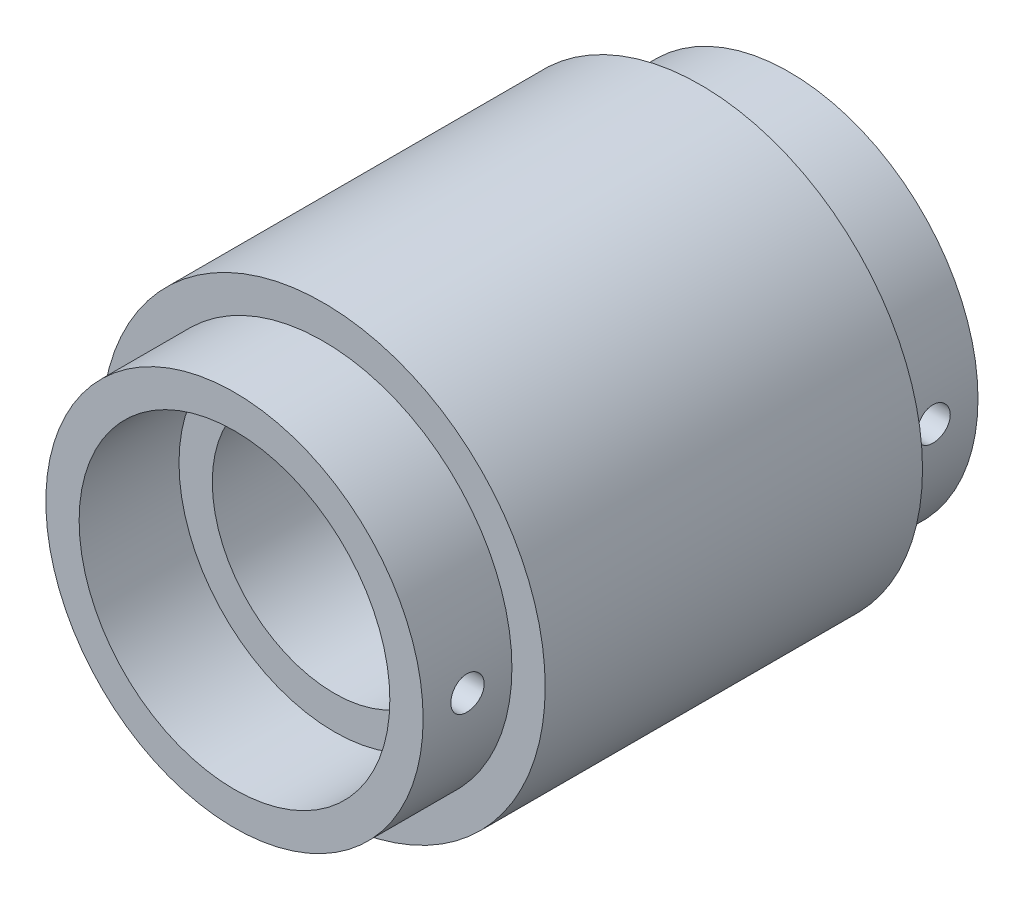
ISO-10303-21;
HEADER;
FILE_DESCRIPTION(('STEP AP214'),'2;1');
FILE_NAME('part.step','',(''),(''),'','','');
FILE_SCHEMA(('AUTOMOTIVE_DESIGN { 1 0 10303 214 1 1 1 1 }'));
ENDSEC;
DATA;
#1=APPLICATION_CONTEXT('core data for automotive mechanical design processes');
#2=APPLICATION_PROTOCOL_DEFINITION('international standard','automotive_design',2000,#1);
#3=PRODUCT_CONTEXT('',#1,'mechanical');
#4=PRODUCT('Part','Part','',(#3));
#5=PRODUCT_RELATED_PRODUCT_CATEGORY('part','',(#4));
#6=PRODUCT_DEFINITION_FORMATION('','',#4);
#7=PRODUCT_DEFINITION_CONTEXT('part definition',#1,'design');
#8=PRODUCT_DEFINITION('design','',#6,#7);
#9=PRODUCT_DEFINITION_SHAPE('','',#8);
#10=(LENGTH_UNIT() NAMED_UNIT(*) SI_UNIT(.MILLI.,.METRE.));
#11=(NAMED_UNIT(*) PLANE_ANGLE_UNIT() SI_UNIT($,.RADIAN.));
#12=(NAMED_UNIT(*) SI_UNIT($,.STERADIAN.) SOLID_ANGLE_UNIT());
#13=UNCERTAINTY_MEASURE_WITH_UNIT(LENGTH_MEASURE(1.E-05),#10,'distance_accuracy_value','');
#14=(GEOMETRIC_REPRESENTATION_CONTEXT(3) GLOBAL_UNCERTAINTY_ASSIGNED_CONTEXT((#13)) GLOBAL_UNIT_ASSIGNED_CONTEXT((#10,
#11,#12)) REPRESENTATION_CONTEXT('',''));
#15=CARTESIAN_POINT('',(0.,0.,0.));
#16=DIRECTION('',(0.,0.,1.));
#17=DIRECTION('',(1.,0.,0.));
#18=AXIS2_PLACEMENT_3D('',#15,#16,#17);
#19=CARTESIAN_POINT('',(0.,0.,25.));
#20=DIRECTION('',(0.,0.,1.));
#21=DIRECTION('',(1.,0.,0.));
#22=AXIS2_PLACEMENT_3D('',#19,#20,#21);
#23=CYLINDRICAL_SURFACE('',#22,14.);
#24=CARTESIAN_POINT('',(0.,0.,16.));
#25=DIRECTION('',(0.,0.,1.));
#26=DIRECTION('',(1.,0.,0.));
#27=AXIS2_PLACEMENT_3D('',#24,#25,#26);
#28=CIRCLE('',#27,14.);
#29=CARTESIAN_POINT('',(14.,0.,16.));
#30=VERTEX_POINT('',#29);
#31=EDGE_CURVE('E45',#30,#30,#28,.T.);
#32=ORIENTED_EDGE('',*,*,#31,.F.);
#33=EDGE_LOOP('',(#32));
#34=FACE_BOUND('',#33,.T.);
#35=CARTESIAN_POINT('',(0.,0.,25.));
#36=DIRECTION('',(0.,0.,1.));
#37=DIRECTION('',(1.,0.,0.));
#38=AXIS2_PLACEMENT_3D('',#35,#36,#37);
#39=CIRCLE('',#38,14.);
#40=CARTESIAN_POINT('',(14.,0.,25.));
#41=VERTEX_POINT('',#40);
#42=EDGE_CURVE('E50',#41,#41,#39,.T.);
#43=ORIENTED_EDGE('',*,*,#42,.T.);
#44=EDGE_LOOP('',(#43));
#45=FACE_BOUND('',#44,.T.);
#46=CARTESIAN_POINT('',(14.,0.,19.5));
#47=CARTESIAN_POINT('',(13.9999989720618,-0.0839973684623563,19.5000036207019));
#48=CARTESIAN_POINT('',(13.9992360275065,-0.168049471788861,19.5070793221215));
#49=CARTESIAN_POINT('',(13.9962658597227,-0.333821153364659,19.5351975840512));
#50=CARTESIAN_POINT('',(13.9940570672004,-0.415538096384693,19.5562553207345));
#51=CARTESIAN_POINT('',(13.9884444049242,-0.57421508667919,19.6117156111501));
#52=CARTESIAN_POINT('',(13.9850412789497,-0.651178059521744,19.6461098608724));
#53=CARTESIAN_POINT('',(13.9774199420794,-0.798222664781041,19.7272501675866));
#54=CARTESIAN_POINT('',(13.9732018874118,-0.868305612275355,19.7739938577237));
#55=CARTESIAN_POINT('',(13.964403436078,-0.999904467230661,19.8787117019334));
#56=CARTESIAN_POINT('',(13.959821772381,-1.06138815276101,19.9367262467107));
#57=CARTESIAN_POINT('',(13.9508228918212,-1.17376607832023,20.0622526231375));
#58=CARTESIAN_POINT('',(13.9464056827682,-1.22465981597738,20.1297649050912));
#59=CARTESIAN_POINT('',(13.9382230587834,-1.31452903007566,20.2725742909414));
#60=CARTESIAN_POINT('',(13.9344592647275,-1.35347504707262,20.3478900343593));
#61=CARTESIAN_POINT('',(13.9280256549691,-1.41815517868436,20.5040394574843));
#62=CARTESIAN_POINT('',(13.9253558084694,-1.44388966523887,20.5848729817787));
#63=CARTESIAN_POINT('',(13.9214240491911,-1.48131999143385,20.7494329661843));
#64=CARTESIAN_POINT('',(13.9201567479638,-1.49306957301225,20.8331470713884));
#65=CARTESIAN_POINT('',(13.919156916522,-1.50236273378441,21.0013678978012));
#66=CARTESIAN_POINT('',(13.9194243403621,-1.49990673825451,21.0858745952063));
#67=CARTESIAN_POINT('',(13.9214588185844,-1.48090270755366,21.2529102447853));
#68=CARTESIAN_POINT('',(13.9232196140191,-1.46441348676883,21.3354459753885));
#69=CARTESIAN_POINT('',(13.92803266796,-1.41790265413675,21.4965718512746));
#70=CARTESIAN_POINT('',(13.9310849462276,-1.38788083522162,21.575161936163));
#71=CARTESIAN_POINT('',(13.9381442300285,-1.31509254595635,21.7263506188431));
#72=CARTESIAN_POINT('',(13.9421531763498,-1.27230012313471,21.7989366277697));
#73=CARTESIAN_POINT('',(13.9506724910759,-1.17520397125327,21.9359189016586));
#74=CARTESIAN_POINT('',(13.9551828763347,-1.12089985521526,22.0003148911879));
#75=CARTESIAN_POINT('',(13.964224741634,-1.00199398737118,22.1194308272547));
#76=CARTESIAN_POINT('',(13.9687562128002,-0.937341467650282,22.1741001088758));
#77=CARTESIAN_POINT('',(13.9773081517919,-0.799749932702071,22.2718176057708));
#78=CARTESIAN_POINT('',(13.9813286189078,-0.726810905968591,22.3148658049081));
#79=CARTESIAN_POINT('',(13.9884071619177,-0.574680679930815,22.388117667482));
#80=CARTESIAN_POINT('',(13.9914650333095,-0.495488156543225,22.4183186020122));
#81=CARTESIAN_POINT('',(13.996271832416,-0.333116173755533,22.4649806998032));
#82=CARTESIAN_POINT('',(13.9980208050858,-0.249936851389132,22.4814423349517));
#83=CARTESIAN_POINT('',(14.0000069536861,-0.0823910032591094,22.5000939080794));
#84=CARTESIAN_POINT('',(14.0002515320482,0.00196765896146679,22.5023537278468));
#85=CARTESIAN_POINT('',(13.999221220073,0.169862499172725,22.4927212957146));
#86=CARTESIAN_POINT('',(13.9979463533593,0.253398689930396,22.4808292638405));
#87=CARTESIAN_POINT('',(13.9940250997174,0.417074417596072,22.4432886972512));
#88=CARTESIAN_POINT('',(13.9913819912927,0.497221580734069,22.4176730412053));
#89=CARTESIAN_POINT('',(13.9850206034345,0.65208162535116,22.3534462526011));
#90=CARTESIAN_POINT('',(13.9813022965487,0.726794368015866,22.3148347882255));
#91=CARTESIAN_POINT('',(13.9731875979172,0.86897969817229,22.2255402299778));
#92=CARTESIAN_POINT('',(13.9687886603917,0.936423420726919,22.174811409086));
#93=CARTESIAN_POINT('',(13.9598140395794,1.0618636536134,22.062787475555));
#94=CARTESIAN_POINT('',(13.955238351189,1.11985989089444,22.001492057626));
#95=CARTESIAN_POINT('',(13.9464035114229,1.22500289525196,21.8697691835129));
#96=CARTESIAN_POINT('',(13.9421457513136,1.27210367548466,21.799304913417));
#97=CARTESIAN_POINT('',(13.9344504956076,1.35380220515131,21.6514253530529));
#98=CARTESIAN_POINT('',(13.9310129873748,1.38840014719751,21.5740101698898));
#99=CARTESIAN_POINT('',(13.9253563662176,1.44403456823946,21.4145815618943));
#100=CARTESIAN_POINT('',(13.9231348303938,1.4650980301971,21.3325776426312));
#101=CARTESIAN_POINT('',(13.9201543262932,1.49315296500731,21.1661718429898));
#102=CARTESIAN_POINT('',(13.9193953092803,1.50014490677259,21.0817700426125));
#103=CARTESIAN_POINT('',(13.9194269169975,1.49985126967978,20.913421505837));
#104=CARTESIAN_POINT('',(13.9202097012228,1.49263792882135,20.8294746326706));
#105=CARTESIAN_POINT('',(13.9232199578512,1.46429034750351,20.6639928721513));
#106=CARTESIAN_POINT('',(13.9254474315429,1.44315609462868,20.5824579869496));
#107=CARTESIAN_POINT('',(13.9310938471125,1.38758726934598,20.4241176286987));
#108=CARTESIAN_POINT('',(13.9345125661186,1.35315518471867,20.3473112741425));
#109=CARTESIAN_POINT('',(13.9421567007954,1.27197540134453,20.2005560163175));
#110=CARTESIAN_POINT('',(13.9463821158424,1.22522771211909,20.1306071077473));
#111=CARTESIAN_POINT('',(13.9551893042071,1.12047309614238,19.9991822389677));
#112=CARTESIAN_POINT('',(13.9597727171597,1.06241229533165,19.9377493283454));
#113=CARTESIAN_POINT('',(13.9687645955809,0.936788436693426,19.8254680641987));
#114=CARTESIAN_POINT('',(13.9731730190714,0.869223116281761,19.7746222381358));
#115=CARTESIAN_POINT('',(13.9813315236118,0.726294289727543,19.6848415429898));
#116=CARTESIAN_POINT('',(13.985079694864,0.650909132345846,19.6459409923291));
#117=CARTESIAN_POINT('',(13.9914751074927,0.494683050163402,19.5814034976389));
#118=CARTESIAN_POINT('',(13.9941235777272,0.413848333053747,19.5557517409156));
#119=CARTESIAN_POINT('',(13.997362764335,0.277138279310811,19.5247693925093));
#120=CARTESIAN_POINT('',(13.9983470622526,0.222133982989379,19.5154937322981));
#121=CARTESIAN_POINT('',(13.9996660194708,0.111427819030549,19.5031078501412));
#122=CARTESIAN_POINT('',(14.0000006819599,0.0557259548181628,19.4999975979358));
#123=CARTESIAN_POINT('',(14.,0.,19.5));
#124=B_SPLINE_CURVE_WITH_KNOTS('',3,(#46,#47,#48,#49,#50,#51,#52,#53,#54,#55,#56,#57,#58,#59,
#60,#61,#62,#63,#64,#65,#66,#67,#68,#69,#70,#71,#72,#73,#74,#75,#76,#77,#78,#79,#80,#81,#82,#83,
#84,#85,#86,#87,#88,#89,#90,#91,#92,#93,#94,#95,#96,#97,#98,#99,#100,#101,#102,#103,#104,#105,
#106,#107,#108,#109,#110,#111,#112,#113,#114,#115,#116,#117,#118,#119,#120,#121,#122,#123),
.UNSPECIFIED.,.T.,.F.,(4,2,2,2,2,2,2,2,2,2,2,2,2,2,2,2,2,2,2,2,2,2,2,2,2,2,2,2,2,2,2,2,2,2,2,2,
2,2,4),(0.,0.251788599945356,0.503850940260848,0.75575658476305,1.00761398480183,
1.26039117907525,1.5131803619984,1.76658792718727,2.01998835788766,2.27241183115226,
2.52482774758373,2.77619094881418,3.02755799638761,3.27943939251041,3.531329257246,
3.78449503509989,4.03766116448934,4.29088104245253,4.54409222301009,4.79605646471764,
5.04801678907028,5.29937615584524,5.55074194097749,5.80307171791346,6.05540878638004,
6.30879222304767,6.56217175605479,6.81504455967777,7.06790893654699,7.31949074464278,
7.57107277711321,7.82260776597884,8.07414256037933,8.32690582829998,8.57972936954861,
8.8332726124194,9.08653176657271,9.25357544028005,9.42061829413531),.UNSPECIFIED.);
#125=CARTESIAN_POINT('',(14.,0.,19.5));
#126=VERTEX_POINT('',#125);
#127=EDGE_CURVE('E90',#126,#126,#124,.T.);
#128=ORIENTED_EDGE('',*,*,#127,.F.);
#129=EDGE_LOOP('',(#128));
#130=FACE_BOUND('',#129,.T.);
#131=ADVANCED_FACE('F37',(#34,#45,#130),#23,.F.);
#132=CARTESIAN_POINT('',(0.,0.,17.));
#133=DIRECTION('',(0.,0.,1.));
#134=DIRECTION('',(1.,0.,0.));
#135=AXIS2_PLACEMENT_3D('',#132,#133,#134);
#136=CYLINDRICAL_SURFACE('',#135,17.);
#137=CARTESIAN_POINT('',(0.,0.,25.));
#138=DIRECTION('',(0.,0.,1.));
#139=DIRECTION('',(1.,0.,0.));
#140=AXIS2_PLACEMENT_3D('',#137,#138,#139);
#141=CIRCLE('',#140,17.);
#142=CARTESIAN_POINT('',(17.,0.,25.));
#143=VERTEX_POINT('',#142);
#144=EDGE_CURVE('E62',#143,#143,#141,.T.);
#145=ORIENTED_EDGE('',*,*,#144,.F.);
#146=EDGE_LOOP('',(#145));
#147=FACE_BOUND('',#146,.T.);
#148=CARTESIAN_POINT('',(0.,0.,17.));
#149=DIRECTION('',(0.,0.,1.));
#150=DIRECTION('',(1.,0.,0.));
#151=AXIS2_PLACEMENT_3D('',#148,#149,#150);
#152=CIRCLE('',#151,17.);
#153=CARTESIAN_POINT('',(17.,0.,17.));
#154=VERTEX_POINT('',#153);
#155=EDGE_CURVE('E61',#154,#154,#152,.T.);
#156=ORIENTED_EDGE('',*,*,#155,.T.);
#157=EDGE_LOOP('',(#156));
#158=FACE_BOUND('',#157,.T.);
#159=CARTESIAN_POINT('',(17.,0.,22.5));
#160=CARTESIAN_POINT('',(16.9999991366692,0.0840802358664998,22.4999963358136));
#161=CARTESIAN_POINT('',(16.9993695779826,0.168217256556168,22.4929067281508));
#162=CARTESIAN_POINT('',(16.9969186756702,0.334162101229269,22.4647299984391));
#163=CARTESIAN_POINT('',(16.9950959921048,0.41596719842642,22.4436271384143));
#164=CARTESIAN_POINT('',(16.9904647505681,0.574820875222161,22.3880400381334));
#165=CARTESIAN_POINT('',(16.987656760896,0.651872166635591,22.3535635102583));
#166=CARTESIAN_POINT('',(16.9813695548534,0.79907619798614,22.2722218661469));
#167=CARTESIAN_POINT('',(16.9778904793125,0.869230380650742,22.2253593483915));
#168=CARTESIAN_POINT('',(16.9706402702899,1.00086587600031,22.1204326359042));
#169=CARTESIAN_POINT('',(16.9668684232275,1.06232489780315,22.062340523003));
#170=CARTESIAN_POINT('',(16.9594637448475,1.17463411612825,21.9366628211714));
#171=CARTESIAN_POINT('',(16.9558309197295,1.22548383998342,21.8690768094917));
#172=CARTESIAN_POINT('',(16.9491080590586,1.31520757683625,21.726193431763));
#173=CARTESIAN_POINT('',(16.9460189232131,1.35406181812048,21.6508836040906));
#174=CARTESIAN_POINT('',(16.9407415951097,1.4185653804641,21.4947770863768));
#175=CARTESIAN_POINT('',(16.9385533852002,1.44421496024305,21.4139805038728));
#176=CARTESIAN_POINT('',(16.9353318119117,1.48151599727451,21.2494186319148));
#177=CARTESIAN_POINT('',(16.9342954355067,1.4932039820181,21.1656616820616));
#178=CARTESIAN_POINT('',(16.9334854039232,1.50236291350133,20.9973689116293));
#179=CARTESIAN_POINT('',(16.9337117224385,1.49983415642455,20.9128331073131));
#180=CARTESIAN_POINT('',(16.9353987670437,1.48066155151999,20.7456330149522));
#181=CARTESIAN_POINT('',(16.9368560169532,1.46405745233264,20.6629641290013));
#182=CARTESIAN_POINT('',(16.9408352833957,1.41726727227211,20.5015911801985));
#183=CARTESIAN_POINT('',(16.9433573114304,1.38708104468568,20.422887160185));
#184=CARTESIAN_POINT('',(16.949185966917,1.31393915314471,20.2715516941627));
#185=CARTESIAN_POINT('',(16.9524936854572,1.27096571042549,20.1989288845309));
#186=CARTESIAN_POINT('',(16.9595200433788,1.17348205158942,20.0619117959138));
#187=CARTESIAN_POINT('',(16.9632386921032,1.11897157314286,19.9975177040868));
#188=CARTESIAN_POINT('',(16.9706833852774,0.999738513125818,19.8785548838013));
#189=CARTESIAN_POINT('',(16.9744094114053,0.934981578037634,19.8240205798198));
#190=CARTESIAN_POINT('',(16.9814369213681,0.79721351153508,19.7265917065545));
#191=CARTESIAN_POINT('',(16.984738404872,0.724202373686212,19.6836971463444));
#192=CARTESIAN_POINT('',(16.9905455904275,0.57197563768315,19.6107673127884));
#193=CARTESIAN_POINT('',(16.9930511943361,0.492759275839952,19.5807336252059));
#194=CARTESIAN_POINT('',(16.996983221751,0.330381291940775,19.5344024948699));
#195=CARTESIAN_POINT('',(16.9984096703698,0.247219761738225,19.5181047324754));
#196=CARTESIAN_POINT('',(17.0000194423459,0.0796104030231021,19.499751387245));
#197=CARTESIAN_POINT('',(17.0002069148657,-0.00483218206200055,19.4976482679761));
#198=CARTESIAN_POINT('',(16.9993287054252,-0.172868703136017,19.5076192906525));
#199=CARTESIAN_POINT('',(16.9982630365922,-0.256462648005644,19.5196932840849));
#200=CARTESIAN_POINT('',(16.9950010291973,-0.420292963294032,19.5576363855799));
#201=CARTESIAN_POINT('',(16.9928065018153,-0.500534490142742,19.5834833981096));
#202=CARTESIAN_POINT('',(16.9875332102989,-0.655542086495677,19.6482162300089));
#203=CARTESIAN_POINT('',(16.9844544305543,-0.73030805930762,19.687102279566));
#204=CARTESIAN_POINT('',(16.9777472136144,-0.872458160373809,19.7769283803514));
#205=CARTESIAN_POINT('',(16.9741173526791,-0.939822365439241,19.827899852119));
#206=CARTESIAN_POINT('',(16.9667203650642,-1.06505544188414,19.940404609123));
#207=CARTESIAN_POINT('',(16.9629532357112,-1.12292412819998,20.0019381001608));
#208=CARTESIAN_POINT('',(16.9556939504594,-1.22768709603156,20.1340267804784));
#209=CARTESIAN_POINT('',(16.9522025910796,-1.27455030776123,20.2046066618826));
#210=CARTESIAN_POINT('',(16.9459016871797,-1.35575886575025,20.35266202157));
#211=CARTESIAN_POINT('',(16.9430921351492,-1.39010434989805,20.4301374238842));
#212=CARTESIAN_POINT('',(16.9384775839307,-1.44524983562932,20.5896755241072));
#213=CARTESIAN_POINT('',(16.9366711856513,-1.46606870960856,20.6717316565099));
#214=CARTESIAN_POINT('',(16.9342628924147,-1.49363139208435,20.8381915045614));
#215=CARTESIAN_POINT('',(16.9336609712026,-1.5003755073806,20.9225951689984));
#216=CARTESIAN_POINT('',(16.9337302183425,-1.49959349529965,21.0910453959998));
#217=CARTESIAN_POINT('',(16.934397031893,-1.49211618154857,21.1750921912636));
#218=CARTESIAN_POINT('',(16.936919354309,-1.46320550589638,21.340731154193));
#219=CARTESIAN_POINT('',(16.9387748648697,-1.44177212409336,21.4223233183579));
#220=CARTESIAN_POINT('',(16.9434643498395,-1.38557040876227,21.5807390934135));
#221=CARTESIAN_POINT('',(16.9462982480851,-1.35080311320261,21.6575630749392));
#222=CARTESIAN_POINT('',(16.9526253396978,-1.26892580427019,21.8042920474838));
#223=CARTESIAN_POINT('',(16.9561185245598,-1.22181595011684,21.8741971277408));
#224=CARTESIAN_POINT('',(16.9633848931066,-1.11640728077523,22.0053539357469));
#225=CARTESIAN_POINT('',(16.9671589585558,-1.05807223244496,22.0665764947836));
#226=CARTESIAN_POINT('',(16.9745537766173,-0.931936963261482,22.1783875140416));
#227=CARTESIAN_POINT('',(16.97817449202,-0.864134462128933,22.2289734049954));
#228=CARTESIAN_POINT('',(16.9848619761362,-0.72084309897252,22.3181516747292));
#229=CARTESIAN_POINT('',(16.9879276001517,-0.645338844429666,22.3567193852657));
#230=CARTESIAN_POINT('',(16.9931463894423,-0.488949731353307,22.4205795640191));
#231=CARTESIAN_POINT('',(16.9953005975204,-0.408071145215391,22.4458872117813));
#232=CARTESIAN_POINT('',(16.9979040364892,-0.272267186189504,22.4761005258256));
#233=CARTESIAN_POINT('',(16.9986864208092,-0.218213808395126,22.485050825264));
#234=CARTESIAN_POINT('',(16.9997346827935,-0.109448307539669,22.4970017459999));
#235=CARTESIAN_POINT('',(17.0000005620279,-0.0547361864815625,22.5000023853833));
#236=CARTESIAN_POINT('',(17.,0.,22.5));
#237=B_SPLINE_CURVE_WITH_KNOTS('',3,(#159,#160,#161,#162,#163,#164,#165,#166,#167,#168,#169,
#170,#171,#172,#173,#174,#175,#176,#177,#178,#179,#180,#181,#182,#183,#184,#185,#186,#187,#188,
#189,#190,#191,#192,#193,#194,#195,#196,#197,#198,#199,#200,#201,#202,#203,#204,#205,#206,#207,
#208,#209,#210,#211,#212,#213,#214,#215,#216,#217,#218,#219,#220,#221,#222,#223,#224,#225,#226,
#227,#228,#229,#230,#231,#232,#233,#234,#235,#236),.UNSPECIFIED.,.T.,.F.,(4,2,2,2,2,2,2,2,2,2,2,
2,2,2,2,2,2,2,2,2,2,2,2,2,2,2,2,2,2,2,2,2,2,2,2,2,2,2,4),(0.,0.252040852757286,
0.504365246877548,0.756544345352494,1.00867058061989,1.26143188749012,1.51420445301807,
1.76739145693377,2.02057349995601,2.27309168593404,2.52560461111023,2.77740680852379,
3.02921172595373,3.28136839051263,3.53353078923872,3.78655726723963,4.03958394248665,
4.2926418072939,4.54569378316716,4.79789789108671,5.05009935705509,5.30189743849976,
5.55369996535094,5.80616446692186,6.05863388833424,6.31180771599296,6.5649787547431,
6.81779580511232,7.07060734455154,7.32255269951578,7.57449841376498,7.8264245194705,
8.07834737548103,8.33109746875406,8.58390854338802,8.83723516529166,9.09027115274212,
9.25435010556812,9.4184285596224),.UNSPECIFIED.);
#238=CARTESIAN_POINT('',(17.,0.,22.5));
#239=VERTEX_POINT('',#238);
#240=EDGE_CURVE('E123',#239,#239,#237,.T.);
#241=ORIENTED_EDGE('',*,*,#240,.T.);
#242=EDGE_LOOP('',(#241));
#243=FACE_BOUND('',#242,.T.);
#244=ADVANCED_FACE('F149',(#147,#158,#243),#136,.T.);
#245=CARTESIAN_POINT('',(0.,0.,-25.));
#246=DIRECTION('',(0.,0.,-1.));
#247=DIRECTION('',(-1.,0.,0.));
#248=AXIS2_PLACEMENT_3D('',#245,#246,#247);
#249=CYLINDRICAL_SURFACE('',#248,14.);
#250=CARTESIAN_POINT('',(0.,0.,-16.));
#251=DIRECTION('',(0.,0.,-1.));
#252=DIRECTION('',(-1.,0.,0.));
#253=AXIS2_PLACEMENT_3D('',#250,#251,#252);
#254=CIRCLE('',#253,14.);
#255=CARTESIAN_POINT('',(-14.,0.,-16.));
#256=VERTEX_POINT('',#255);
#257=EDGE_CURVE('E73',#256,#256,#254,.T.);
#258=ORIENTED_EDGE('',*,*,#257,.F.);
#259=EDGE_LOOP('',(#258));
#260=FACE_BOUND('',#259,.T.);
#261=CARTESIAN_POINT('',(0.,0.,-25.));
#262=DIRECTION('',(0.,0.,-1.));
#263=DIRECTION('',(-1.,0.,0.));
#264=AXIS2_PLACEMENT_3D('',#261,#262,#263);
#265=CIRCLE('',#264,14.);
#266=CARTESIAN_POINT('',(-14.,0.,-25.));
#267=VERTEX_POINT('',#266);
#268=EDGE_CURVE('E77',#267,#267,#265,.T.);
#269=ORIENTED_EDGE('',*,*,#268,.T.);
#270=EDGE_LOOP('',(#269));
#271=FACE_BOUND('',#270,.T.);
#272=CARTESIAN_POINT('',(14.,0.,-19.5));
#273=CARTESIAN_POINT('',(13.9999989720618,0.0839973684623563,-19.5000036207019));
#274=CARTESIAN_POINT('',(13.9992360275065,0.168049471788861,-19.5070793221215));
#275=CARTESIAN_POINT('',(13.9962658597227,0.333821153364659,-19.5351975840512));
#276=CARTESIAN_POINT('',(13.9940570672004,0.415538096384693,-19.5562553207345));
#277=CARTESIAN_POINT('',(13.9884444049242,0.57421508667919,-19.6117156111501));
#278=CARTESIAN_POINT('',(13.9850412789497,0.651178059521744,-19.6461098608724));
#279=CARTESIAN_POINT('',(13.9774199420794,0.798222664781041,-19.7272501675866));
#280=CARTESIAN_POINT('',(13.9732018874118,0.868305612275355,-19.7739938577237));
#281=CARTESIAN_POINT('',(13.964403436078,0.999904467230661,-19.8787117019334));
#282=CARTESIAN_POINT('',(13.959821772381,1.06138815276101,-19.9367262467107));
#283=CARTESIAN_POINT('',(13.9508228918212,1.17376607832023,-20.0622526231375));
#284=CARTESIAN_POINT('',(13.9464056827682,1.22465981597738,-20.1297649050912));
#285=CARTESIAN_POINT('',(13.9382230587834,1.31452903007566,-20.2725742909414));
#286=CARTESIAN_POINT('',(13.9344592647275,1.35347504707262,-20.3478900343593));
#287=CARTESIAN_POINT('',(13.9280256549691,1.41815517868436,-20.5040394574843));
#288=CARTESIAN_POINT('',(13.9253558084694,1.44388966523887,-20.5848729817787));
#289=CARTESIAN_POINT('',(13.9214240491911,1.48131999143385,-20.7494329661843));
#290=CARTESIAN_POINT('',(13.9201567479638,1.49306957301225,-20.8331470713884));
#291=CARTESIAN_POINT('',(13.919156916522,1.50236273378441,-21.0013678978012));
#292=CARTESIAN_POINT('',(13.9194243403621,1.49990673825451,-21.0858745952063));
#293=CARTESIAN_POINT('',(13.9214588185844,1.48090270755366,-21.2529102447853));
#294=CARTESIAN_POINT('',(13.9232196140191,1.46441348676883,-21.3354459753885));
#295=CARTESIAN_POINT('',(13.92803266796,1.41790265413675,-21.4965718512746));
#296=CARTESIAN_POINT('',(13.9310849462276,1.38788083522162,-21.575161936163));
#297=CARTESIAN_POINT('',(13.9381442300285,1.31509254595635,-21.7263506188431));
#298=CARTESIAN_POINT('',(13.9421531763498,1.27230012313471,-21.7989366277697));
#299=CARTESIAN_POINT('',(13.9506724910759,1.17520397125327,-21.9359189016586));
#300=CARTESIAN_POINT('',(13.9551828763347,1.12089985521526,-22.0003148911879));
#301=CARTESIAN_POINT('',(13.964224741634,1.00199398737118,-22.1194308272547));
#302=CARTESIAN_POINT('',(13.9687562128002,0.937341467650282,-22.1741001088758));
#303=CARTESIAN_POINT('',(13.9773081517919,0.799749932702071,-22.2718176057708));
#304=CARTESIAN_POINT('',(13.9813286189078,0.726810905968591,-22.3148658049081));
#305=CARTESIAN_POINT('',(13.9884071619177,0.574680679930815,-22.388117667482));
#306=CARTESIAN_POINT('',(13.9914650333095,0.495488156543225,-22.4183186020122));
#307=CARTESIAN_POINT('',(13.996271832416,0.333116173755533,-22.4649806998032));
#308=CARTESIAN_POINT('',(13.9980208050858,0.249936851389132,-22.4814423349517));
#309=CARTESIAN_POINT('',(14.0000069536861,0.0823910032591094,-22.5000939080794));
#310=CARTESIAN_POINT('',(14.0002515320482,-0.00196765896146679,-22.5023537278468));
#311=CARTESIAN_POINT('',(13.999221220073,-0.169862499172725,-22.4927212957146));
#312=CARTESIAN_POINT('',(13.9979463533593,-0.253398689930396,-22.4808292638405));
#313=CARTESIAN_POINT('',(13.9940250997174,-0.417074417596072,-22.4432886972512));
#314=CARTESIAN_POINT('',(13.9913819912927,-0.497221580734069,-22.4176730412053));
#315=CARTESIAN_POINT('',(13.9850206034345,-0.65208162535116,-22.3534462526011));
#316=CARTESIAN_POINT('',(13.9813022965487,-0.726794368015866,-22.3148347882255));
#317=CARTESIAN_POINT('',(13.9731875979172,-0.86897969817229,-22.2255402299778));
#318=CARTESIAN_POINT('',(13.9687886603917,-0.936423420726919,-22.174811409086));
#319=CARTESIAN_POINT('',(13.9598140395794,-1.0618636536134,-22.062787475555));
#320=CARTESIAN_POINT('',(13.955238351189,-1.11985989089444,-22.001492057626));
#321=CARTESIAN_POINT('',(13.9464035114229,-1.22500289525196,-21.8697691835129));
#322=CARTESIAN_POINT('',(13.9421457513136,-1.27210367548466,-21.799304913417));
#323=CARTESIAN_POINT('',(13.9344504956076,-1.35380220515131,-21.6514253530529));
#324=CARTESIAN_POINT('',(13.9310129873748,-1.38840014719751,-21.5740101698898));
#325=CARTESIAN_POINT('',(13.9253563662176,-1.44403456823946,-21.4145815618943));
#326=CARTESIAN_POINT('',(13.9231348303938,-1.4650980301971,-21.3325776426312));
#327=CARTESIAN_POINT('',(13.9201543262932,-1.49315296500731,-21.1661718429898));
#328=CARTESIAN_POINT('',(13.9193953092803,-1.50014490677259,-21.0817700426125));
#329=CARTESIAN_POINT('',(13.9194269169975,-1.49985126967978,-20.913421505837));
#330=CARTESIAN_POINT('',(13.9202097012228,-1.49263792882135,-20.8294746326706));
#331=CARTESIAN_POINT('',(13.9232199578512,-1.46429034750351,-20.6639928721513));
#332=CARTESIAN_POINT('',(13.9254474315429,-1.44315609462868,-20.5824579869496));
#333=CARTESIAN_POINT('',(13.9310938471125,-1.38758726934598,-20.4241176286987));
#334=CARTESIAN_POINT('',(13.9345125661186,-1.35315518471867,-20.3473112741425));
#335=CARTESIAN_POINT('',(13.9421567007954,-1.27197540134453,-20.2005560163175));
#336=CARTESIAN_POINT('',(13.9463821158424,-1.22522771211909,-20.1306071077473));
#337=CARTESIAN_POINT('',(13.9551893042071,-1.12047309614238,-19.9991822389677));
#338=CARTESIAN_POINT('',(13.9597727171597,-1.06241229533165,-19.9377493283454));
#339=CARTESIAN_POINT('',(13.9687645955809,-0.936788436693426,-19.8254680641987));
#340=CARTESIAN_POINT('',(13.9731730190714,-0.869223116281761,-19.7746222381358));
#341=CARTESIAN_POINT('',(13.9813315236118,-0.726294289727543,-19.6848415429898));
#342=CARTESIAN_POINT('',(13.985079694864,-0.650909132345846,-19.6459409923291));
#343=CARTESIAN_POINT('',(13.9914751074927,-0.494683050163402,-19.5814034976389));
#344=CARTESIAN_POINT('',(13.9941235777272,-0.413848333053747,-19.5557517409156));
#345=CARTESIAN_POINT('',(13.997362764335,-0.277138279310811,-19.5247693925093));
#346=CARTESIAN_POINT('',(13.9983470622526,-0.222133982989379,-19.5154937322981));
#347=CARTESIAN_POINT('',(13.9996660194708,-0.111427819030549,-19.5031078501412));
#348=CARTESIAN_POINT('',(14.0000006819599,-0.0557259548181628,-19.4999975979358));
#349=CARTESIAN_POINT('',(14.,0.,-19.5));
#350=B_SPLINE_CURVE_WITH_KNOTS('',3,(#272,#273,#274,#275,#276,#277,#278,#279,#280,#281,#282,
#283,#284,#285,#286,#287,#288,#289,#290,#291,#292,#293,#294,#295,#296,#297,#298,#299,#300,#301,
#302,#303,#304,#305,#306,#307,#308,#309,#310,#311,#312,#313,#314,#315,#316,#317,#318,#319,#320,
#321,#322,#323,#324,#325,#326,#327,#328,#329,#330,#331,#332,#333,#334,#335,#336,#337,#338,#339,
#340,#341,#342,#343,#344,#345,#346,#347,#348,#349),.UNSPECIFIED.,.T.,.F.,(4,2,2,2,2,2,2,2,2,2,2,
2,2,2,2,2,2,2,2,2,2,2,2,2,2,2,2,2,2,2,2,2,2,2,2,2,2,2,4),(0.,0.251788599945356,
0.503850940260848,0.75575658476305,1.00761398480183,1.26039117907525,1.5131803619984,
1.76658792718727,2.01998835788766,2.27241183115226,2.52482774758373,2.77619094881418,
3.02755799638761,3.27943939251041,3.531329257246,3.78449503509989,4.03766116448934,
4.29088104245253,4.54409222301009,4.79605646471764,5.04801678907028,5.29937615584524,
5.55074194097749,5.80307171791346,6.05540878638004,6.30879222304767,6.56217175605479,
6.81504455967777,7.06790893654699,7.31949074464278,7.57107277711321,7.82260776597884,
8.07414256037933,8.32690582829998,8.57972936954861,8.8332726124194,9.08653176657271,
9.25357544028005,9.42061829413531),.UNSPECIFIED.);
#351=CARTESIAN_POINT('',(14.,0.,-19.5));
#352=VERTEX_POINT('',#351);
#353=EDGE_CURVE('E102',#352,#352,#350,.T.);
#354=ORIENTED_EDGE('',*,*,#353,.F.);
#355=EDGE_LOOP('',(#354));
#356=FACE_BOUND('',#355,.T.);
#357=ADVANCED_FACE('F140',(#260,#271,#356),#249,.F.);
#358=CARTESIAN_POINT('',(0.,0.,-17.));
#359=DIRECTION('',(0.,0.,-1.));
#360=DIRECTION('',(-1.,0.,0.));
#361=AXIS2_PLACEMENT_3D('',#358,#359,#360);
#362=CYLINDRICAL_SURFACE('',#361,17.);
#363=CARTESIAN_POINT('',(0.,0.,-17.));
#364=DIRECTION('',(0.,0.,1.));
#365=DIRECTION('',(1.,0.,0.));
#366=AXIS2_PLACEMENT_3D('',#363,#364,#365);
#367=CIRCLE('',#366,17.);
#368=CARTESIAN_POINT('',(17.,0.,-17.));
#369=VERTEX_POINT('',#368);
#370=EDGE_CURVE('E85',#369,#369,#367,.T.);
#371=ORIENTED_EDGE('',*,*,#370,.F.);
#372=EDGE_LOOP('',(#371));
#373=FACE_BOUND('',#372,.T.);
#374=CARTESIAN_POINT('',(0.,0.,-25.));
#375=DIRECTION('',(0.,0.,1.));
#376=DIRECTION('',(1.,0.,0.));
#377=AXIS2_PLACEMENT_3D('',#374,#375,#376);
#378=CIRCLE('',#377,17.);
#379=CARTESIAN_POINT('',(17.,0.,-25.));
#380=VERTEX_POINT('',#379);
#381=EDGE_CURVE('E86',#380,#380,#378,.T.);
#382=ORIENTED_EDGE('',*,*,#381,.T.);
#383=EDGE_LOOP('',(#382));
#384=FACE_BOUND('',#383,.T.);
#385=CARTESIAN_POINT('',(17.,0.,-19.5));
#386=CARTESIAN_POINT('',(16.9999991366692,0.0840802358664998,-19.5000036641864));
#387=CARTESIAN_POINT('',(16.9993695779826,0.168217256556168,-19.5070932718492));
#388=CARTESIAN_POINT('',(16.9969186756702,0.334162101229269,-19.5352700015609));
#389=CARTESIAN_POINT('',(16.9950959921048,0.41596719842642,-19.5563728615857));
#390=CARTESIAN_POINT('',(16.9904647505681,0.574820875222161,-19.6119599618666));
#391=CARTESIAN_POINT('',(16.987656760896,0.651872166635591,-19.6464364897417));
#392=CARTESIAN_POINT('',(16.9813695548534,0.79907619798614,-19.7277781338531));
#393=CARTESIAN_POINT('',(16.9778904793125,0.869230380650742,-19.7746406516085));
#394=CARTESIAN_POINT('',(16.9706402702899,1.00086587600031,-19.8795673640958));
#395=CARTESIAN_POINT('',(16.9668684232275,1.06232489780315,-19.937659476997));
#396=CARTESIAN_POINT('',(16.9594637448475,1.17463411612825,-20.0633371788286));
#397=CARTESIAN_POINT('',(16.9558309197295,1.22548383998342,-20.1309231905083));
#398=CARTESIAN_POINT('',(16.9491080590586,1.31520757683625,-20.273806568237));
#399=CARTESIAN_POINT('',(16.9460189232131,1.35406181812048,-20.3491163959094));
#400=CARTESIAN_POINT('',(16.9407415951097,1.4185653804641,-20.5052229136232));
#401=CARTESIAN_POINT('',(16.9385533852002,1.44421496024305,-20.5860194961272));
#402=CARTESIAN_POINT('',(16.9353318119117,1.48151599727451,-20.7505813680852));
#403=CARTESIAN_POINT('',(16.9342954355067,1.4932039820181,-20.8343383179384));
#404=CARTESIAN_POINT('',(16.9334854039232,1.50236291350133,-21.0026310883707));
#405=CARTESIAN_POINT('',(16.9337117224385,1.49983415642455,-21.0871668926869));
#406=CARTESIAN_POINT('',(16.9353987670437,1.48066155151999,-21.2543669850478));
#407=CARTESIAN_POINT('',(16.9368560169532,1.46405745233264,-21.3370358709987));
#408=CARTESIAN_POINT('',(16.9408352833957,1.41726727227211,-21.4984088198015));
#409=CARTESIAN_POINT('',(16.9433573114304,1.38708104468568,-21.577112839815));
#410=CARTESIAN_POINT('',(16.949185966917,1.31393915314471,-21.7284483058373));
#411=CARTESIAN_POINT('',(16.9524936854572,1.27096571042549,-21.8010711154691));
#412=CARTESIAN_POINT('',(16.9595200433788,1.17348205158942,-21.9380882040862));
#413=CARTESIAN_POINT('',(16.9632386921032,1.11897157314286,-22.0024822959132));
#414=CARTESIAN_POINT('',(16.9706833852774,0.999738513125818,-22.1214451161987));
#415=CARTESIAN_POINT('',(16.9744094114053,0.934981578037634,-22.1759794201802));
#416=CARTESIAN_POINT('',(16.9814369213681,0.79721351153508,-22.2734082934455));
#417=CARTESIAN_POINT('',(16.984738404872,0.724202373686213,-22.3163028536556));
#418=CARTESIAN_POINT('',(16.9905455904275,0.57197563768315,-22.3892326872116));
#419=CARTESIAN_POINT('',(16.9930511943361,0.492759275839952,-22.4192663747941));
#420=CARTESIAN_POINT('',(16.996983221751,0.330381291940775,-22.4655975051301));
#421=CARTESIAN_POINT('',(16.9984096703698,0.247219761738225,-22.4818952675246));
#422=CARTESIAN_POINT('',(17.0000194423459,0.0796104030231021,-22.500248612755));
#423=CARTESIAN_POINT('',(17.0002069148657,-0.00483218206200055,-22.5023517320239));
#424=CARTESIAN_POINT('',(16.9993287054252,-0.172868703136017,-22.4923807093475));
#425=CARTESIAN_POINT('',(16.9982630365922,-0.256462648005644,-22.4803067159151));
#426=CARTESIAN_POINT('',(16.9950010291973,-0.420292963294032,-22.4423636144201));
#427=CARTESIAN_POINT('',(16.9928065018153,-0.500534490142742,-22.4165166018904));
#428=CARTESIAN_POINT('',(16.9875332102989,-0.655542086495677,-22.3517837699911));
#429=CARTESIAN_POINT('',(16.9844544305543,-0.73030805930762,-22.312897720434));
#430=CARTESIAN_POINT('',(16.9777472136144,-0.872458160373809,-22.2230716196486));
#431=CARTESIAN_POINT('',(16.9741173526791,-0.939822365439241,-22.172100147881));
#432=CARTESIAN_POINT('',(16.9667203650642,-1.06505544188414,-22.059595390877));
#433=CARTESIAN_POINT('',(16.9629532357112,-1.12292412819998,-21.9980618998392));
#434=CARTESIAN_POINT('',(16.9556939504594,-1.22768709603156,-21.8659732195216));
#435=CARTESIAN_POINT('',(16.9522025910796,-1.27455030776123,-21.7953933381174));
#436=CARTESIAN_POINT('',(16.9459016871797,-1.35575886575025,-21.64733797843));
#437=CARTESIAN_POINT('',(16.9430921351492,-1.39010434989805,-21.5698625761158));
#438=CARTESIAN_POINT('',(16.9384775839307,-1.44524983562932,-21.4103244758928));
#439=CARTESIAN_POINT('',(16.9366711856513,-1.46606870960856,-21.3282683434901));
#440=CARTESIAN_POINT('',(16.9342628924147,-1.49363139208435,-21.1618084954386));
#441=CARTESIAN_POINT('',(16.9336609712026,-1.5003755073806,-21.0774048310016));
#442=CARTESIAN_POINT('',(16.9337302183425,-1.49959349529965,-20.9089546040002));
#443=CARTESIAN_POINT('',(16.934397031893,-1.49211618154857,-20.8249078087364));
#444=CARTESIAN_POINT('',(16.936919354309,-1.46320550589638,-20.659268845807));
#445=CARTESIAN_POINT('',(16.9387748648697,-1.44177212409336,-20.5776766816421));
#446=CARTESIAN_POINT('',(16.9434643498395,-1.38557040876227,-20.4192609065865));
#447=CARTESIAN_POINT('',(16.9462982480851,-1.35080311320261,-20.3424369250608));
#448=CARTESIAN_POINT('',(16.9526253396978,-1.26892580427019,-20.1957079525162));
#449=CARTESIAN_POINT('',(16.9561185245598,-1.22181595011684,-20.1258028722592));
#450=CARTESIAN_POINT('',(16.9633848931066,-1.11640728077523,-19.9946460642531));
#451=CARTESIAN_POINT('',(16.9671589585558,-1.05807223244496,-19.9334235052164));
#452=CARTESIAN_POINT('',(16.9745537766173,-0.931936963261482,-19.8216124859584));
#453=CARTESIAN_POINT('',(16.97817449202,-0.864134462128933,-19.7710265950046));
#454=CARTESIAN_POINT('',(16.9848619761362,-0.72084309897252,-19.6818483252708));
#455=CARTESIAN_POINT('',(16.9879276001517,-0.645338844429666,-19.6432806147343));
#456=CARTESIAN_POINT('',(16.9931463894423,-0.488949731353307,-19.5794204359809));
#457=CARTESIAN_POINT('',(16.9953005975204,-0.408071145215391,-19.5541127882188));
#458=CARTESIAN_POINT('',(16.9979040364892,-0.272267186189504,-19.5238994741744));
#459=CARTESIAN_POINT('',(16.9986864208092,-0.218213808395126,-19.514949174736));
#460=CARTESIAN_POINT('',(16.9997346827935,-0.109448307539669,-19.5029982540001));
#461=CARTESIAN_POINT('',(17.0000005620279,-0.0547361864815625,-19.4999976146167));
#462=CARTESIAN_POINT('',(17.,0.,-19.5));
#463=B_SPLINE_CURVE_WITH_KNOTS('',3,(#385,#386,#387,#388,#389,#390,#391,#392,#393,#394,#395,
#396,#397,#398,#399,#400,#401,#402,#403,#404,#405,#406,#407,#408,#409,#410,#411,#412,#413,#414,
#415,#416,#417,#418,#419,#420,#421,#422,#423,#424,#425,#426,#427,#428,#429,#430,#431,#432,#433,
#434,#435,#436,#437,#438,#439,#440,#441,#442,#443,#444,#445,#446,#447,#448,#449,#450,#451,#452,
#453,#454,#455,#456,#457,#458,#459,#460,#461,#462),.UNSPECIFIED.,.T.,.F.,(4,2,2,2,2,2,2,2,2,2,2,
2,2,2,2,2,2,2,2,2,2,2,2,2,2,2,2,2,2,2,2,2,2,2,2,2,2,2,4),(0.,0.252040852757286,
0.504365246877548,0.756544345352494,1.00867058061989,1.26143188749012,1.51420445301807,
1.76739145693377,2.02057349995601,2.27309168593404,2.52560461111023,2.7774068085238,
3.02921172595373,3.28136839051263,3.53353078923872,3.78655726723962,4.03958394248665,
4.2926418072939,4.54569378316716,4.79789789108671,5.05009935705509,5.30189743849976,
5.55369996535094,5.80616446692186,6.05863388833424,6.31180771599296,6.5649787547431,
6.81779580511232,7.07060734455154,7.32255269951578,7.57449841376498,7.8264245194705,
8.07834737548103,8.33109746875406,8.58390854338802,8.83723516529166,9.09027115274212,
9.25435010556812,9.4184285596224),.UNSPECIFIED.);
#464=CARTESIAN_POINT('',(17.,0.,-19.5));
#465=VERTEX_POINT('',#464);
#466=EDGE_CURVE('E129',#465,#465,#463,.T.);
#467=ORIENTED_EDGE('',*,*,#466,.T.);
#468=EDGE_LOOP('',(#467));
#469=FACE_BOUND('',#468,.T.);
#470=ADVANCED_FACE('F137',(#373,#384,#469),#362,.T.);
#471=CARTESIAN_POINT('',(0.,0.,25.));
#472=DIRECTION('',(0.,0.,-1.));
#473=DIRECTION('',(-1.,0.,0.));
#474=AXIS2_PLACEMENT_3D('',#471,#472,#473);
#475=CYLINDRICAL_SURFACE('',#474,20.);
#476=CARTESIAN_POINT('',(0.,0.,17.));
#477=DIRECTION('',(0.,0.,1.));
#478=DIRECTION('',(1.,0.,0.));
#479=AXIS2_PLACEMENT_3D('',#476,#477,#478);
#480=CIRCLE('',#479,20.);
#481=CARTESIAN_POINT('',(20.,0.,17.));
#482=VERTEX_POINT('',#481);
#483=EDGE_CURVE('E55',#482,#482,#480,.T.);
#484=ORIENTED_EDGE('',*,*,#483,.F.);
#485=EDGE_LOOP('',(#484));
#486=FACE_BOUND('',#485,.T.);
#487=CARTESIAN_POINT('',(0.,0.,-17.));
#488=DIRECTION('',(0.,0.,1.));
#489=DIRECTION('',(1.,0.,0.));
#490=AXIS2_PLACEMENT_3D('',#487,#488,#489);
#491=CIRCLE('',#490,20.);
#492=CARTESIAN_POINT('',(20.,0.,-17.));
#493=VERTEX_POINT('',#492);
#494=EDGE_CURVE('E81',#493,#493,#491,.T.);
#495=ORIENTED_EDGE('',*,*,#494,.T.);
#496=EDGE_LOOP('',(#495));
#497=FACE_BOUND('',#496,.T.);
#498=ADVANCED_FACE('F39',(#486,#497),#475,.T.);
#499=CARTESIAN_POINT('',(0.,0.,-25.));
#500=DIRECTION('',(0.,0.,1.));
#501=DIRECTION('',(1.,0.,0.));
#502=AXIS2_PLACEMENT_3D('',#499,#500,#501);
#503=PLANE('',#502);
#504=ORIENTED_EDGE('',*,*,#268,.F.);
#505=EDGE_LOOP('',(#504));
#506=FACE_BOUND('',#505,.T.);
#507=ORIENTED_EDGE('',*,*,#381,.F.);
#508=EDGE_LOOP('',(#507));
#509=FACE_BOUND('',#508,.T.);
#510=ADVANCED_FACE('F180',(#506,#509),#503,.F.);
#511=CARTESIAN_POINT('',(0.,0.,25.));
#512=DIRECTION('',(0.,0.,1.));
#513=DIRECTION('',(1.,0.,0.));
#514=AXIS2_PLACEMENT_3D('',#511,#512,#513);
#515=PLANE('',#514);
#516=ORIENTED_EDGE('',*,*,#42,.F.);
#517=EDGE_LOOP('',(#516));
#518=FACE_BOUND('',#517,.T.);
#519=ORIENTED_EDGE('',*,*,#144,.T.);
#520=EDGE_LOOP('',(#519));
#521=FACE_BOUND('',#520,.T.);
#522=ADVANCED_FACE('F177',(#518,#521),#515,.T.);
#523=CARTESIAN_POINT('',(0.,0.,25.));
#524=DIRECTION('',(0.,0.,1.));
#525=DIRECTION('',(1.,0.,0.));
#526=AXIS2_PLACEMENT_3D('',#523,#524,#525);
#527=CYLINDRICAL_SURFACE('',#526,11.);
#528=CARTESIAN_POINT('',(0.,0.,-16.));
#529=DIRECTION('',(0.,0.,-1.));
#530=DIRECTION('',(-1.,0.,0.));
#531=AXIS2_PLACEMENT_3D('',#528,#529,#530);
#532=CIRCLE('',#531,11.);
#533=CARTESIAN_POINT('',(-11.,0.,-16.));
#534=VERTEX_POINT('',#533);
#535=EDGE_CURVE('E66',#534,#534,#532,.T.);
#536=ORIENTED_EDGE('',*,*,#535,.T.);
#537=EDGE_LOOP('',(#536));
#538=FACE_BOUND('',#537,.T.);
#539=CARTESIAN_POINT('',(0.,0.,16.));
#540=DIRECTION('',(0.,0.,1.));
#541=DIRECTION('',(1.,0.,0.));
#542=AXIS2_PLACEMENT_3D('',#539,#540,#541);
#543=CIRCLE('',#542,11.);
#544=CARTESIAN_POINT('',(11.,0.,16.));
#545=VERTEX_POINT('',#544);
#546=EDGE_CURVE('E10',#545,#545,#543,.T.);
#547=ORIENTED_EDGE('',*,*,#546,.T.);
#548=EDGE_LOOP('',(#547));
#549=FACE_BOUND('',#548,.T.);
#550=ADVANCED_FACE('F163',(#538,#549),#527,.F.);
#551=CARTESIAN_POINT('',(11.,0.,16.));
#552=DIRECTION('',(0.,0.,-1.));
#553=DIRECTION('',(-1.,0.,0.));
#554=AXIS2_PLACEMENT_3D('',#551,#552,#553);
#555=PLANE('',#554);
#556=ORIENTED_EDGE('',*,*,#546,.F.);
#557=EDGE_LOOP('',(#556));
#558=FACE_BOUND('',#557,.T.);
#559=ORIENTED_EDGE('',*,*,#31,.T.);
#560=EDGE_LOOP('',(#559));
#561=FACE_BOUND('',#560,.T.);
#562=ADVANCED_FACE('F158',(#558,#561),#555,.F.);
#563=CARTESIAN_POINT('',(0.,0.,17.));
#564=DIRECTION('',(0.,0.,1.));
#565=DIRECTION('',(1.,0.,0.));
#566=AXIS2_PLACEMENT_3D('',#563,#564,#565);
#567=PLANE('',#566);
#568=ORIENTED_EDGE('',*,*,#155,.F.);
#569=EDGE_LOOP('',(#568));
#570=FACE_BOUND('',#569,.T.);
#571=ORIENTED_EDGE('',*,*,#483,.T.);
#572=EDGE_LOOP('',(#571));
#573=FACE_BOUND('',#572,.T.);
#574=ADVANCED_FACE('F153',(#570,#573),#567,.T.);
#575=CARTESIAN_POINT('',(11.,0.,-16.));
#576=DIRECTION('',(0.,0.,1.));
#577=DIRECTION('',(1.,0.,0.));
#578=AXIS2_PLACEMENT_3D('',#575,#576,#577);
#579=PLANE('',#578);
#580=ORIENTED_EDGE('',*,*,#535,.F.);
#581=EDGE_LOOP('',(#580));
#582=FACE_BOUND('',#581,.T.);
#583=ORIENTED_EDGE('',*,*,#257,.T.);
#584=EDGE_LOOP('',(#583));
#585=FACE_BOUND('',#584,.T.);
#586=ADVANCED_FACE('F144',(#582,#585),#579,.F.);
#587=CARTESIAN_POINT('',(0.,0.,-17.));
#588=DIRECTION('',(0.,0.,-1.));
#589=DIRECTION('',(1.,0.,0.));
#590=AXIS2_PLACEMENT_3D('',#587,#588,#589);
#591=PLANE('',#590);
#592=ORIENTED_EDGE('',*,*,#494,.F.);
#593=EDGE_LOOP('',(#592));
#594=FACE_BOUND('',#593,.T.);
#595=ORIENTED_EDGE('',*,*,#370,.T.);
#596=EDGE_LOOP('',(#595));
#597=FACE_BOUND('',#596,.T.);
#598=ADVANCED_FACE('F142',(#594,#597),#591,.T.);
#599=CARTESIAN_POINT('',(20.001,0.,-21.));
#600=DIRECTION('',(-1.,0.,0.));
#601=DIRECTION('',(0.,0.,1.));
#602=AXIS2_PLACEMENT_3D('',#599,#600,#601);
#603=CYLINDRICAL_SURFACE('',#602,1.5);
#604=ORIENTED_EDGE('',*,*,#466,.F.);
#605=EDGE_LOOP('',(#604));
#606=FACE_BOUND('',#605,.T.);
#607=ORIENTED_EDGE('',*,*,#353,.T.);
#608=EDGE_LOOP('',(#607));
#609=FACE_BOUND('',#608,.T.);
#610=ADVANCED_FACE('F116',(#606,#609),#603,.F.);
#611=CARTESIAN_POINT('',(20.001,0.,21.));
#612=DIRECTION('',(-1.,0.,0.));
#613=DIRECTION('',(0.,0.,1.));
#614=AXIS2_PLACEMENT_3D('',#611,#612,#613);
#615=CYLINDRICAL_SURFACE('',#614,1.5);
#616=ORIENTED_EDGE('',*,*,#240,.F.);
#617=EDGE_LOOP('',(#616));
#618=FACE_BOUND('',#617,.T.);
#619=ORIENTED_EDGE('',*,*,#127,.T.);
#620=EDGE_LOOP('',(#619));
#621=FACE_BOUND('',#620,.T.);
#622=ADVANCED_FACE('F112',(#618,#621),#615,.F.);
#623=CLOSED_SHELL('',(#131,#244,#357,#470,#498,#510,#522,#550,#562,#574,#586,#598,#610,#622));
#624=MANIFOLD_SOLID_BREP('B2',#623);
#625=ADVANCED_BREP_SHAPE_REPRESENTATION('',(#18,#624),#14);
#626=SHAPE_DEFINITION_REPRESENTATION(#9,#625);
ENDSEC;
END-ISO-10303-21;
